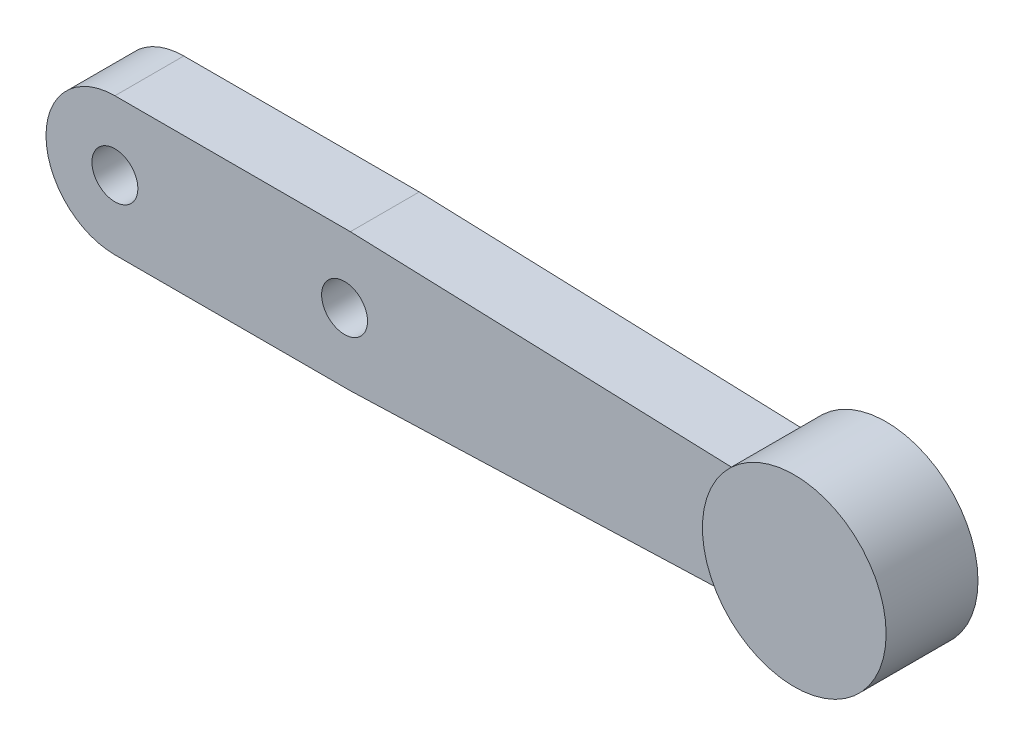
ISO-10303-21;
HEADER;
FILE_DESCRIPTION(('STEP AP214'),'2;1');
FILE_NAME('part.step','',(''),(''),'','','');
FILE_SCHEMA(('AUTOMOTIVE_DESIGN { 1 0 10303 214 1 1 1 1 }'));
ENDSEC;
DATA;
#1=APPLICATION_CONTEXT('core data for automotive mechanical design processes');
#2=APPLICATION_PROTOCOL_DEFINITION('international standard','automotive_design',2000,#1);
#3=PRODUCT_CONTEXT('',#1,'mechanical');
#4=PRODUCT('Part','Part','',(#3));
#5=PRODUCT_RELATED_PRODUCT_CATEGORY('part','',(#4));
#6=PRODUCT_DEFINITION_FORMATION('','',#4);
#7=PRODUCT_DEFINITION_CONTEXT('part definition',#1,'design');
#8=PRODUCT_DEFINITION('design','',#6,#7);
#9=PRODUCT_DEFINITION_SHAPE('','',#8);
#10=(LENGTH_UNIT() NAMED_UNIT(*) SI_UNIT(.MILLI.,.METRE.));
#11=(NAMED_UNIT(*) PLANE_ANGLE_UNIT() SI_UNIT($,.RADIAN.));
#12=(NAMED_UNIT(*) SI_UNIT($,.STERADIAN.) SOLID_ANGLE_UNIT());
#13=UNCERTAINTY_MEASURE_WITH_UNIT(LENGTH_MEASURE(1.E-05),#10,'distance_accuracy_value','');
#14=(GEOMETRIC_REPRESENTATION_CONTEXT(3) GLOBAL_UNCERTAINTY_ASSIGNED_CONTEXT((#13)) GLOBAL_UNIT_ASSIGNED_CONTEXT((#10,
#11,#12)) REPRESENTATION_CONTEXT('',''));
#15=CARTESIAN_POINT('',(0.,0.,0.));
#16=DIRECTION('',(0.,0.,1.));
#17=DIRECTION('',(1.,0.,0.));
#18=AXIS2_PLACEMENT_3D('',#15,#16,#17);
#19=CARTESIAN_POINT('',(0.26215149831417,-7.50703670422191,3.75));
#20=DIRECTION('',(-0.0348994967024939,0.999390827019096,0.));
#21=DIRECTION('',(-0.999390827019096,-0.0348994967024939,0.));
#22=AXIS2_PLACEMENT_3D('',#19,#20,#21);
#23=PLANE('',#22);
#24=DIRECTION('',(0.,0.,-1.));
#25=VECTOR('',#24,1.);
#26=CARTESIAN_POINT('',(42.2370114472895,-6.04124229549565,5.));
#27=LINE('',#26,#25);
#28=CARTESIAN_POINT('',(42.2370114472895,-6.04124229549565,3.75));
#29=VERTEX_POINT('',#28);
#30=CARTESIAN_POINT('',(42.2370114472895,-6.04124229549565,-3.75));
#31=VERTEX_POINT('',#30);
#32=EDGE_CURVE('E65',#29,#31,#27,.T.);
#33=ORIENTED_EDGE('',*,*,#32,.F.);
#34=DIRECTION('',(0.999390827019096,0.0348994967024939,0.));
#35=VECTOR('',#34,1.);
#36=CARTESIAN_POINT('',(0.26215149831417,-7.50703670422191,3.75));
#37=LINE('',#36,#35);
#38=CARTESIAN_POINT('',(0.631823856045043,-7.49412746103012,3.75));
#39=VERTEX_POINT('',#38);
#40=EDGE_CURVE('E138',#39,#29,#37,.T.);
#41=ORIENTED_EDGE('',*,*,#40,.F.);
#42=DIRECTION('',(0.,0.,-1.));
#43=VECTOR('',#42,1.);
#44=CARTESIAN_POINT('',(0.631823856045043,-7.49412746103012,3.75));
#45=LINE('',#44,#43);
#46=CARTESIAN_POINT('',(0.631823856045043,-7.49412746103012,-3.75));
#47=VERTEX_POINT('',#46);
#48=EDGE_CURVE('E175',#39,#47,#45,.T.);
#49=ORIENTED_EDGE('',*,*,#48,.T.);
#50=DIRECTION('',(0.999390827019096,0.0348994967024939,0.));
#51=VECTOR('',#50,1.);
#52=CARTESIAN_POINT('',(0.26215149831417,-7.50703670422191,-3.75));
#53=LINE('',#52,#51);
#54=EDGE_CURVE('E107',#47,#31,#53,.T.);
#55=ORIENTED_EDGE('',*,*,#54,.T.);
#56=EDGE_LOOP('',(#33,#41,#49,#55));
#57=FACE_BOUND('',#56,.T.);
#58=ADVANCED_FACE('F41',(#57),#23,.F.);
#59=CARTESIAN_POINT('',(0.262561145924633,7.51876747695188,3.75));
#60=DIRECTION('',(0.0348994967024939,0.999390827019096,0.));
#61=DIRECTION('',(-0.999390827019096,0.0348994967024939,0.));
#62=AXIS2_PLACEMENT_3D('',#59,#60,#61);
#63=PLANE('',#62);
#64=DIRECTION('',(0.999390827019096,-0.0348994967024939,0.));
#65=VECTOR('',#64,1.);
#66=CARTESIAN_POINT('',(0.262561145924633,7.51876747695188,3.75));
#67=LINE('',#66,#65);
#68=CARTESIAN_POINT('',(0.631823856045043,7.50587253896987,3.75));
#69=VERTEX_POINT('',#68);
#70=CARTESIAN_POINT('',(42.2370114472895,6.05298737343539,3.75));
#71=VERTEX_POINT('',#70);
#72=EDGE_CURVE('E112',#69,#71,#67,.T.);
#73=ORIENTED_EDGE('',*,*,#72,.T.);
#74=DIRECTION('',(0.,0.,-1.));
#75=VECTOR('',#74,1.);
#76=CARTESIAN_POINT('',(42.2370114472895,6.05298737343539,5.));
#77=LINE('',#76,#75);
#78=CARTESIAN_POINT('',(42.2370114472895,6.05298737343539,-3.75));
#79=VERTEX_POINT('',#78);
#80=EDGE_CURVE('E110',#71,#79,#77,.T.);
#81=ORIENTED_EDGE('',*,*,#80,.T.);
#82=DIRECTION('',(0.999390827019096,-0.0348994967024939,0.));
#83=VECTOR('',#82,1.);
#84=CARTESIAN_POINT('',(0.262561145924633,7.51876747695188,-3.75));
#85=LINE('',#84,#83);
#86=CARTESIAN_POINT('',(0.631823856045043,7.50587253896987,-3.75));
#87=VERTEX_POINT('',#86);
#88=EDGE_CURVE('E98',#87,#79,#85,.T.);
#89=ORIENTED_EDGE('',*,*,#88,.F.);
#90=DIRECTION('',(0.,0.,-1.));
#91=VECTOR('',#90,1.);
#92=CARTESIAN_POINT('',(0.631823856045043,7.50587253896987,3.75));
#93=LINE('',#92,#91);
#94=EDGE_CURVE('E172',#69,#87,#93,.T.);
#95=ORIENTED_EDGE('',*,*,#94,.F.);
#96=EDGE_LOOP('',(#73,#81,#89,#95));
#97=FACE_BOUND('',#96,.T.);
#98=ADVANCED_FACE('F111',(#97),#63,.T.);
#99=CARTESIAN_POINT('',(-25.,0.00587253896988193,3.75));
#100=DIRECTION('',(0.,0.,-1.));
#101=DIRECTION('',(-1.,0.,0.));
#102=AXIS2_PLACEMENT_3D('',#99,#100,#101);
#103=CYLINDRICAL_SURFACE('',#102,7.5);
#104=CARTESIAN_POINT('',(-25.,0.00587253896988193,-3.75));
#105=DIRECTION('',(0.,0.,1.));
#106=DIRECTION('',(1.,0.,0.));
#107=AXIS2_PLACEMENT_3D('',#104,#105,#106);
#108=CIRCLE('',#107,7.5);
#109=CARTESIAN_POINT('',(-25.,7.50587253896988,-3.75));
#110=VERTEX_POINT('',#109);
#111=CARTESIAN_POINT('',(-25.,-7.49412746103012,-3.75));
#112=VERTEX_POINT('',#111);
#113=EDGE_CURVE('E154',#110,#112,#108,.T.);
#114=ORIENTED_EDGE('',*,*,#113,.T.);
#115=DIRECTION('',(0.,0.,-1.));
#116=VECTOR('',#115,1.);
#117=CARTESIAN_POINT('',(-25.,-7.49412746103012,3.75));
#118=LINE('',#117,#116);
#119=CARTESIAN_POINT('',(-25.,-7.49412746103012,3.75));
#120=VERTEX_POINT('',#119);
#121=EDGE_CURVE('E50',#120,#112,#118,.T.);
#122=ORIENTED_EDGE('',*,*,#121,.F.);
#123=CARTESIAN_POINT('',(-25.,0.00587253896988193,3.75));
#124=DIRECTION('',(0.,0.,1.));
#125=DIRECTION('',(1.,0.,0.));
#126=AXIS2_PLACEMENT_3D('',#123,#124,#125);
#127=CIRCLE('',#126,7.5);
#128=CARTESIAN_POINT('',(-25.,7.50587253896988,3.75));
#129=VERTEX_POINT('',#128);
#130=EDGE_CURVE('E130',#129,#120,#127,.T.);
#131=ORIENTED_EDGE('',*,*,#130,.F.);
#132=DIRECTION('',(0.,0.,-1.));
#133=VECTOR('',#132,1.);
#134=CARTESIAN_POINT('',(-25.,7.50587253896988,3.75));
#135=LINE('',#134,#133);
#136=EDGE_CURVE('E150',#129,#110,#135,.T.);
#137=ORIENTED_EDGE('',*,*,#136,.T.);
#138=EDGE_LOOP('',(#114,#122,#131,#137));
#139=FACE_BOUND('',#138,.T.);
#140=ADVANCED_FACE('F185',(#139),#103,.T.);
#141=CARTESIAN_POINT('',(0.,-7.49412746103012,3.75));
#142=DIRECTION('',(0.,-1.,0.));
#143=DIRECTION('',(1.,0.,0.));
#144=AXIS2_PLACEMENT_3D('',#141,#142,#143);
#145=PLANE('',#144);
#146=DIRECTION('',(-1.,0.,0.));
#147=VECTOR('',#146,1.);
#148=CARTESIAN_POINT('',(0.,-7.49412746103012,-3.75));
#149=LINE('',#148,#147);
#150=EDGE_CURVE('E158',#47,#112,#149,.T.);
#151=ORIENTED_EDGE('',*,*,#150,.F.);
#152=ORIENTED_EDGE('',*,*,#48,.F.);
#153=DIRECTION('',(-1.,0.,0.));
#154=VECTOR('',#153,1.);
#155=CARTESIAN_POINT('',(0.,-7.49412746103012,3.75));
#156=LINE('',#155,#154);
#157=EDGE_CURVE('E134',#39,#120,#156,.T.);
#158=ORIENTED_EDGE('',*,*,#157,.T.);
#159=ORIENTED_EDGE('',*,*,#121,.T.);
#160=EDGE_LOOP('',(#151,#152,#158,#159));
#161=FACE_BOUND('',#160,.T.);
#162=ADVANCED_FACE('F181',(#161),#145,.T.);
#163=CARTESIAN_POINT('',(0.,7.50587253896987,3.75));
#164=DIRECTION('',(0.,-1.,0.));
#165=DIRECTION('',(1.,0.,0.));
#166=AXIS2_PLACEMENT_3D('',#163,#164,#165);
#167=PLANE('',#166);
#168=DIRECTION('',(-1.,0.,0.));
#169=VECTOR('',#168,1.);
#170=CARTESIAN_POINT('',(0.,7.50587253896987,-3.75));
#171=LINE('',#170,#169);
#172=EDGE_CURVE('E104',#87,#110,#171,.T.);
#173=ORIENTED_EDGE('',*,*,#172,.T.);
#174=ORIENTED_EDGE('',*,*,#136,.F.);
#175=DIRECTION('',(-1.,0.,0.));
#176=VECTOR('',#175,1.);
#177=CARTESIAN_POINT('',(0.,7.50587253896987,3.75));
#178=LINE('',#177,#176);
#179=EDGE_CURVE('E143',#69,#129,#178,.T.);
#180=ORIENTED_EDGE('',*,*,#179,.F.);
#181=ORIENTED_EDGE('',*,*,#94,.T.);
#182=EDGE_LOOP('',(#173,#174,#180,#181));
#183=FACE_BOUND('',#182,.T.);
#184=ADVANCED_FACE('F191',(#183),#167,.F.);
#185=CARTESIAN_POINT('',(0.,0.,3.75));
#186=DIRECTION('',(0.,0.,-1.));
#187=DIRECTION('',(-1.,0.,0.));
#188=AXIS2_PLACEMENT_3D('',#185,#186,#187);
#189=CYLINDRICAL_SURFACE('',#188,2.5);
#190=CARTESIAN_POINT('',(0.,0.,3.75));
#191=DIRECTION('',(0.,0.,1.));
#192=DIRECTION('',(1.,0.,0.));
#193=AXIS2_PLACEMENT_3D('',#190,#191,#192);
#194=CIRCLE('',#193,2.5);
#195=CARTESIAN_POINT('',(2.5,0.,3.75));
#196=VERTEX_POINT('',#195);
#197=EDGE_CURVE('E126',#196,#196,#194,.T.);
#198=ORIENTED_EDGE('',*,*,#197,.T.);
#199=EDGE_LOOP('',(#198));
#200=FACE_BOUND('',#199,.T.);
#201=CARTESIAN_POINT('',(0.,0.,-3.75));
#202=DIRECTION('',(0.,0.,1.));
#203=DIRECTION('',(1.,0.,0.));
#204=AXIS2_PLACEMENT_3D('',#201,#202,#203);
#205=CIRCLE('',#204,2.5);
#206=CARTESIAN_POINT('',(2.5,0.,-3.75));
#207=VERTEX_POINT('',#206);
#208=EDGE_CURVE('E122',#207,#207,#205,.T.);
#209=ORIENTED_EDGE('',*,*,#208,.F.);
#210=EDGE_LOOP('',(#209));
#211=FACE_BOUND('',#210,.T.);
#212=ADVANCED_FACE('F43',(#200,#211),#189,.F.);
#213=CARTESIAN_POINT('',(-25.,0.00587253896988193,3.75));
#214=DIRECTION('',(0.,0.,-1.));
#215=DIRECTION('',(-1.,0.,0.));
#216=AXIS2_PLACEMENT_3D('',#213,#214,#215);
#217=CYLINDRICAL_SURFACE('',#216,2.5);
#218=CARTESIAN_POINT('',(-25.,0.00587253896988193,3.75));
#219=DIRECTION('',(0.,0.,1.));
#220=DIRECTION('',(1.,0.,0.));
#221=AXIS2_PLACEMENT_3D('',#218,#219,#220);
#222=CIRCLE('',#221,2.5);
#223=CARTESIAN_POINT('',(-22.5,0.00587253896988193,3.75));
#224=VERTEX_POINT('',#223);
#225=EDGE_CURVE('E146',#224,#224,#222,.T.);
#226=ORIENTED_EDGE('',*,*,#225,.T.);
#227=EDGE_LOOP('',(#226));
#228=FACE_BOUND('',#227,.T.);
#229=CARTESIAN_POINT('',(-25.,0.00587253896988193,-3.75));
#230=DIRECTION('',(0.,0.,1.));
#231=DIRECTION('',(1.,0.,0.));
#232=AXIS2_PLACEMENT_3D('',#229,#230,#231);
#233=CIRCLE('',#232,2.5);
#234=CARTESIAN_POINT('',(-22.5,0.00587253896988193,-3.75));
#235=VERTEX_POINT('',#234);
#236=EDGE_CURVE('E131',#235,#235,#233,.T.);
#237=ORIENTED_EDGE('',*,*,#236,.F.);
#238=EDGE_LOOP('',(#237));
#239=FACE_BOUND('',#238,.T.);
#240=ADVANCED_FACE('F198',(#228,#239),#217,.F.);
#241=CARTESIAN_POINT('',(0.,0.,3.75));
#242=DIRECTION('',(0.,0.,1.));
#243=DIRECTION('',(1.,0.,0.));
#244=AXIS2_PLACEMENT_3D('',#241,#242,#243);
#245=PLANE('',#244);
#246=ORIENTED_EDGE('',*,*,#197,.F.);
#247=EDGE_LOOP('',(#246));
#248=FACE_BOUND('',#247,.T.);
#249=ORIENTED_EDGE('',*,*,#40,.T.);
#250=CARTESIAN_POINT('',(50.2014575786151,0.00587253896987099,3.75));
#251=DIRECTION('',(0.,0.,1.));
#252=DIRECTION('',(1.,0.,0.));
#253=AXIS2_PLACEMENT_3D('',#250,#251,#252);
#254=CIRCLE('',#253,10.);
#255=EDGE_CURVE('E57',#29,#71,#254,.F.);
#256=ORIENTED_EDGE('',*,*,#255,.T.);
#257=ORIENTED_EDGE('',*,*,#72,.F.);
#258=ORIENTED_EDGE('',*,*,#179,.T.);
#259=ORIENTED_EDGE('',*,*,#130,.T.);
#260=ORIENTED_EDGE('',*,*,#157,.F.);
#261=EDGE_LOOP('',(#249,#256,#257,#258,#259,#260));
#262=FACE_BOUND('',#261,.T.);
#263=ORIENTED_EDGE('',*,*,#225,.F.);
#264=EDGE_LOOP('',(#263));
#265=FACE_BOUND('',#264,.T.);
#266=ADVANCED_FACE('F187',(#248,#262,#265),#245,.T.);
#267=CARTESIAN_POINT('',(0.,0.,-3.75));
#268=DIRECTION('',(0.,0.,1.));
#269=DIRECTION('',(1.,0.,0.));
#270=AXIS2_PLACEMENT_3D('',#267,#268,#269);
#271=PLANE('',#270);
#272=CARTESIAN_POINT('',(50.2014575786151,0.00587253896987099,-3.75));
#273=DIRECTION('',(0.,0.,1.));
#274=DIRECTION('',(1.,0.,0.));
#275=AXIS2_PLACEMENT_3D('',#272,#273,#274);
#276=CIRCLE('',#275,10.);
#277=EDGE_CURVE('E11',#31,#79,#276,.F.);
#278=ORIENTED_EDGE('',*,*,#277,.F.);
#279=ORIENTED_EDGE('',*,*,#54,.F.);
#280=ORIENTED_EDGE('',*,*,#150,.T.);
#281=ORIENTED_EDGE('',*,*,#113,.F.);
#282=ORIENTED_EDGE('',*,*,#172,.F.);
#283=ORIENTED_EDGE('',*,*,#88,.T.);
#284=EDGE_LOOP('',(#278,#279,#280,#281,#282,#283));
#285=FACE_BOUND('',#284,.T.);
#286=ORIENTED_EDGE('',*,*,#208,.T.);
#287=EDGE_LOOP('',(#286));
#288=FACE_BOUND('',#287,.T.);
#289=ORIENTED_EDGE('',*,*,#236,.T.);
#290=EDGE_LOOP('',(#289));
#291=FACE_BOUND('',#290,.T.);
#292=ADVANCED_FACE('F100',(#285,#288,#291),#271,.F.);
#293=CARTESIAN_POINT('',(50.2014575786151,0.00587253896987099,5.));
#294=DIRECTION('',(0.,0.,-1.));
#295=DIRECTION('',(-1.,0.,0.));
#296=AXIS2_PLACEMENT_3D('',#293,#294,#295);
#297=CYLINDRICAL_SURFACE('',#296,10.);
#298=ORIENTED_EDGE('',*,*,#255,.F.);
#299=ORIENTED_EDGE('',*,*,#32,.T.);
#300=ORIENTED_EDGE('',*,*,#277,.T.);
#301=ORIENTED_EDGE('',*,*,#80,.F.);
#302=EDGE_LOOP('',(#298,#299,#300,#301));
#303=FACE_BOUND('',#302,.T.);
#304=CARTESIAN_POINT('',(50.2014575786151,0.00587253896987099,5.));
#305=DIRECTION('',(0.,0.,1.));
#306=DIRECTION('',(1.,0.,0.));
#307=AXIS2_PLACEMENT_3D('',#304,#305,#306);
#308=CIRCLE('',#307,10.);
#309=CARTESIAN_POINT('',(60.2014575786151,0.00587253896987099,5.));
#310=VERTEX_POINT('',#309);
#311=EDGE_CURVE('E115',#310,#310,#308,.T.);
#312=ORIENTED_EDGE('',*,*,#311,.F.);
#313=EDGE_LOOP('',(#312));
#314=FACE_BOUND('',#313,.T.);
#315=CARTESIAN_POINT('',(50.2014575786151,0.00587253896987099,-5.));
#316=DIRECTION('',(0.,0.,1.));
#317=DIRECTION('',(1.,0.,0.));
#318=AXIS2_PLACEMENT_3D('',#315,#316,#317);
#319=CIRCLE('',#318,10.);
#320=CARTESIAN_POINT('',(60.2014575786151,0.00587253896987099,-5.));
#321=VERTEX_POINT('',#320);
#322=EDGE_CURVE('E298',#321,#321,#319,.T.);
#323=ORIENTED_EDGE('',*,*,#322,.T.);
#324=EDGE_LOOP('',(#323));
#325=FACE_BOUND('',#324,.T.);
#326=ADVANCED_FACE('F117',(#303,#314,#325),#297,.T.);
#327=CARTESIAN_POINT('',(50.2014575786151,0.00587253896987099,5.));
#328=DIRECTION('',(0.,0.,1.));
#329=DIRECTION('',(1.,0.,0.));
#330=AXIS2_PLACEMENT_3D('',#327,#328,#329);
#331=PLANE('',#330);
#332=ORIENTED_EDGE('',*,*,#311,.T.);
#333=EDGE_LOOP('',(#332));
#334=FACE_BOUND('',#333,.T.);
#335=ADVANCED_FACE('F273',(#334),#331,.T.);
#336=CARTESIAN_POINT('',(50.2014575786151,0.00587253896987099,-5.));
#337=DIRECTION('',(0.,0.,1.));
#338=DIRECTION('',(1.,0.,0.));
#339=AXIS2_PLACEMENT_3D('',#336,#337,#338);
#340=PLANE('',#339);
#341=ORIENTED_EDGE('',*,*,#322,.F.);
#342=EDGE_LOOP('',(#341));
#343=FACE_BOUND('',#342,.T.);
#344=ADVANCED_FACE('F282',(#343),#340,.F.);
#345=CLOSED_SHELL('',(#58,#98,#140,#162,#184,#212,#240,#266,#292,#326,#335,#344));
#346=MANIFOLD_SOLID_BREP('B2',#345);
#347=ADVANCED_BREP_SHAPE_REPRESENTATION('',(#18,#346),#14);
#348=SHAPE_DEFINITION_REPRESENTATION(#9,#347);
ENDSEC;
END-ISO-10303-21;
